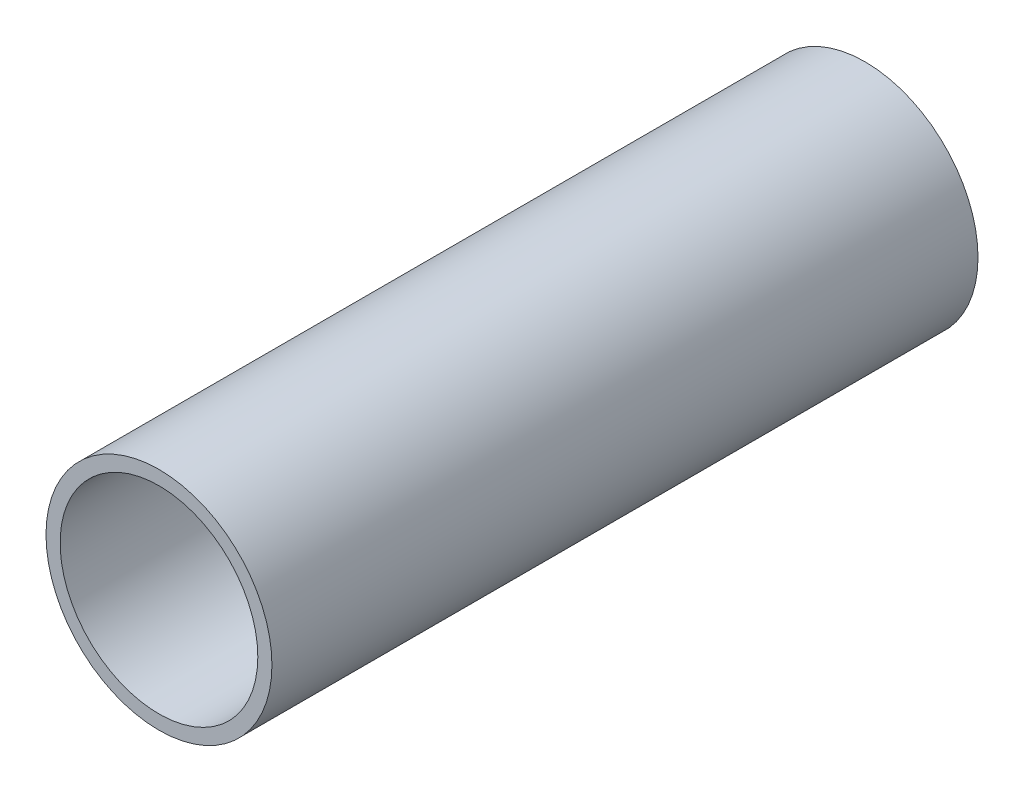
ISO-10303-21;
HEADER;
FILE_DESCRIPTION(('STEP AP214'),'2;1');
FILE_NAME('part.step','',(''),(''),'','','');
FILE_SCHEMA(('AUTOMOTIVE_DESIGN { 1 0 10303 214 1 1 1 1 }'));
ENDSEC;
DATA;
#1=APPLICATION_CONTEXT('core data for automotive mechanical design processes');
#2=APPLICATION_PROTOCOL_DEFINITION('international standard','automotive_design',2000,#1);
#3=PRODUCT_CONTEXT('',#1,'mechanical');
#4=PRODUCT('Part','Part','',(#3));
#5=PRODUCT_RELATED_PRODUCT_CATEGORY('part','',(#4));
#6=PRODUCT_DEFINITION_FORMATION('','',#4);
#7=PRODUCT_DEFINITION_CONTEXT('part definition',#1,'design');
#8=PRODUCT_DEFINITION('design','',#6,#7);
#9=PRODUCT_DEFINITION_SHAPE('','',#8);
#10=(LENGTH_UNIT() NAMED_UNIT(*) SI_UNIT(.MILLI.,.METRE.));
#11=(NAMED_UNIT(*) PLANE_ANGLE_UNIT() SI_UNIT($,.RADIAN.));
#12=(NAMED_UNIT(*) SI_UNIT($,.STERADIAN.) SOLID_ANGLE_UNIT());
#13=UNCERTAINTY_MEASURE_WITH_UNIT(LENGTH_MEASURE(1.E-05),#10,'distance_accuracy_value','');
#14=(GEOMETRIC_REPRESENTATION_CONTEXT(3) GLOBAL_UNCERTAINTY_ASSIGNED_CONTEXT((#13)) GLOBAL_UNIT_ASSIGNED_CONTEXT((#10,
#11,#12)) REPRESENTATION_CONTEXT('',''));
#15=CARTESIAN_POINT('',(0.,0.,0.));
#16=DIRECTION('',(0.,0.,1.));
#17=DIRECTION('',(1.,0.,0.));
#18=AXIS2_PLACEMENT_3D('',#15,#16,#17);
#19=CARTESIAN_POINT('',(0.,0.,250.));
#20=DIRECTION('',(0.,0.,1.));
#21=DIRECTION('',(1.,0.,0.));
#22=AXIS2_PLACEMENT_3D('',#19,#20,#21);
#23=PLANE('',#22);
#24=CARTESIAN_POINT('',(0.,0.,250.));
#25=DIRECTION('',(0.,0.,1.));
#26=DIRECTION('',(1.,0.,0.));
#27=AXIS2_PLACEMENT_3D('',#24,#25,#26);
#28=CIRCLE('',#27,40.);
#29=CARTESIAN_POINT('',(40.,0.,250.));
#30=VERTEX_POINT('',#29);
#31=EDGE_CURVE('E10',#30,#30,#28,.T.);
#32=ORIENTED_EDGE('',*,*,#31,.T.);
#33=EDGE_LOOP('',(#32));
#34=FACE_BOUND('',#33,.T.);
#35=CARTESIAN_POINT('',(0.,0.,250.));
#36=DIRECTION('',(0.,0.,1.));
#37=DIRECTION('',(1.,0.,0.));
#38=AXIS2_PLACEMENT_3D('',#35,#36,#37);
#39=CIRCLE('',#38,35.);
#40=CARTESIAN_POINT('',(35.,0.,250.));
#41=VERTEX_POINT('',#40);
#42=EDGE_CURVE('E50',#41,#41,#39,.T.);
#43=ORIENTED_EDGE('',*,*,#42,.F.);
#44=EDGE_LOOP('',(#43));
#45=FACE_BOUND('',#44,.T.);
#46=ADVANCED_FACE('F37',(#34,#45),#23,.T.);
#47=CARTESIAN_POINT('',(0.,0.,0.));
#48=DIRECTION('',(0.,0.,1.));
#49=DIRECTION('',(1.,0.,0.));
#50=AXIS2_PLACEMENT_3D('',#47,#48,#49);
#51=PLANE('',#50);
#52=CARTESIAN_POINT('',(0.,0.,0.));
#53=DIRECTION('',(0.,0.,1.));
#54=DIRECTION('',(1.,0.,0.));
#55=AXIS2_PLACEMENT_3D('',#52,#53,#54);
#56=CIRCLE('',#55,40.);
#57=CARTESIAN_POINT('',(40.,0.,0.));
#58=VERTEX_POINT('',#57);
#59=EDGE_CURVE('E41',#58,#58,#56,.T.);
#60=ORIENTED_EDGE('',*,*,#59,.F.);
#61=EDGE_LOOP('',(#60));
#62=FACE_BOUND('',#61,.T.);
#63=CARTESIAN_POINT('',(0.,0.,0.));
#64=DIRECTION('',(0.,0.,1.));
#65=DIRECTION('',(1.,0.,0.));
#66=AXIS2_PLACEMENT_3D('',#63,#64,#65);
#67=CIRCLE('',#66,35.);
#68=CARTESIAN_POINT('',(35.,0.,0.));
#69=VERTEX_POINT('',#68);
#70=EDGE_CURVE('E52',#69,#69,#67,.T.);
#71=ORIENTED_EDGE('',*,*,#70,.T.);
#72=EDGE_LOOP('',(#71));
#73=FACE_BOUND('',#72,.T.);
#74=ADVANCED_FACE('F64',(#62,#73),#51,.F.);
#75=CARTESIAN_POINT('',(0.,0.,250.));
#76=DIRECTION('',(0.,0.,-1.));
#77=DIRECTION('',(-1.,0.,0.));
#78=AXIS2_PLACEMENT_3D('',#75,#76,#77);
#79=CYLINDRICAL_SURFACE('',#78,40.);
#80=ORIENTED_EDGE('',*,*,#31,.F.);
#81=EDGE_LOOP('',(#80));
#82=FACE_BOUND('',#81,.T.);
#83=ORIENTED_EDGE('',*,*,#59,.T.);
#84=EDGE_LOOP('',(#83));
#85=FACE_BOUND('',#84,.T.);
#86=ADVANCED_FACE('F39',(#82,#85),#79,.T.);
#87=CARTESIAN_POINT('',(0.,0.,250.));
#88=DIRECTION('',(0.,0.,-1.));
#89=DIRECTION('',(-1.,0.,0.));
#90=AXIS2_PLACEMENT_3D('',#87,#88,#89);
#91=CYLINDRICAL_SURFACE('',#90,35.);
#92=ORIENTED_EDGE('',*,*,#42,.T.);
#93=EDGE_LOOP('',(#92));
#94=FACE_BOUND('',#93,.T.);
#95=ORIENTED_EDGE('',*,*,#70,.F.);
#96=EDGE_LOOP('',(#95));
#97=FACE_BOUND('',#96,.T.);
#98=ADVANCED_FACE('F60',(#94,#97),#91,.F.);
#99=CLOSED_SHELL('',(#46,#74,#86,#98));
#100=MANIFOLD_SOLID_BREP('B2',#99);
#101=ADVANCED_BREP_SHAPE_REPRESENTATION('',(#18,#100),#14);
#102=SHAPE_DEFINITION_REPRESENTATION(#9,#101);
ENDSEC;
END-ISO-10303-21;
